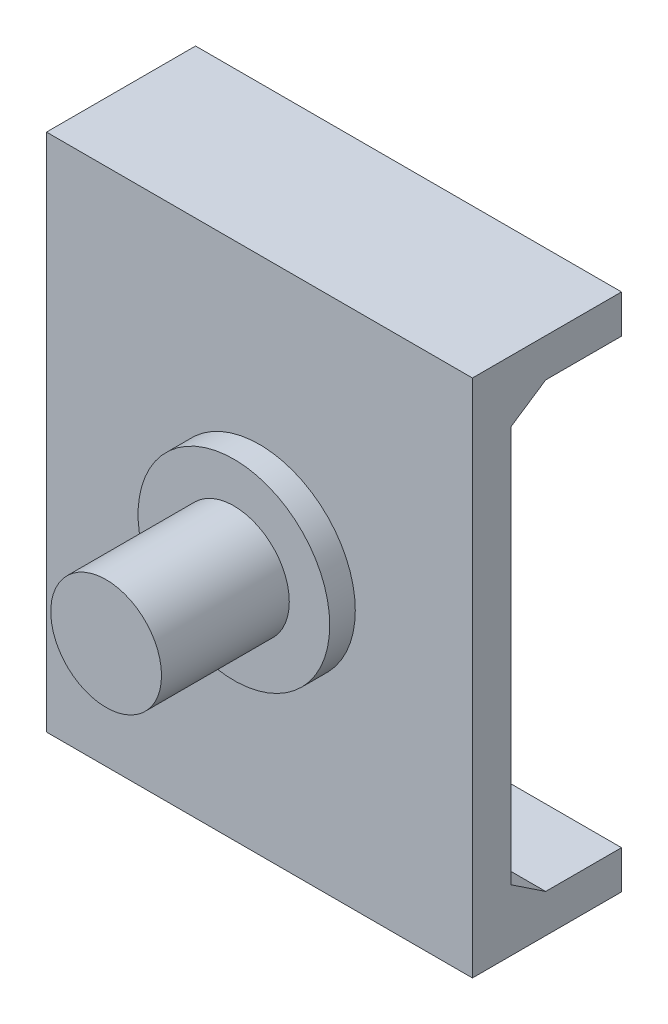
ISO-10303-21;
HEADER;
FILE_DESCRIPTION(('STEP AP214'),'2;1');
FILE_NAME('part.step','',(''),(''),'','','');
FILE_SCHEMA(('AUTOMOTIVE_DESIGN { 1 0 10303 214 1 1 1 1 }'));
ENDSEC;
DATA;
#1=APPLICATION_CONTEXT('core data for automotive mechanical design processes');
#2=APPLICATION_PROTOCOL_DEFINITION('international standard','automotive_design',2000,#1);
#3=PRODUCT_CONTEXT('',#1,'mechanical');
#4=PRODUCT('Part','Part','',(#3));
#5=PRODUCT_RELATED_PRODUCT_CATEGORY('part','',(#4));
#6=PRODUCT_DEFINITION_FORMATION('','',#4);
#7=PRODUCT_DEFINITION_CONTEXT('part definition',#1,'design');
#8=PRODUCT_DEFINITION('design','',#6,#7);
#9=PRODUCT_DEFINITION_SHAPE('','',#8);
#10=(LENGTH_UNIT() NAMED_UNIT(*) SI_UNIT(.MILLI.,.METRE.));
#11=(NAMED_UNIT(*) PLANE_ANGLE_UNIT() SI_UNIT($,.RADIAN.));
#12=(NAMED_UNIT(*) SI_UNIT($,.STERADIAN.) SOLID_ANGLE_UNIT());
#13=UNCERTAINTY_MEASURE_WITH_UNIT(LENGTH_MEASURE(1.E-05),#10,'distance_accuracy_value','');
#14=(GEOMETRIC_REPRESENTATION_CONTEXT(3) GLOBAL_UNCERTAINTY_ASSIGNED_CONTEXT((#13)) GLOBAL_UNIT_ASSIGNED_CONTEXT((#10,
#11,#12)) REPRESENTATION_CONTEXT('',''));
#15=CARTESIAN_POINT('',(0.,0.,0.));
#16=DIRECTION('',(0.,0.,1.));
#17=DIRECTION('',(1.,0.,0.));
#18=AXIS2_PLACEMENT_3D('',#15,#16,#17);
#19=CARTESIAN_POINT('',(0.,0.,-5.));
#20=DIRECTION('',(0.,0.,-1.));
#21=DIRECTION('',(-1.,0.,0.));
#22=AXIS2_PLACEMENT_3D('',#19,#20,#21);
#23=PLANE('',#22);
#24=DIRECTION('',(-1.,0.,0.));
#25=VECTOR('',#24,1.);
#26=CARTESIAN_POINT('',(0.,-10.4,-5.));
#27=LINE('',#26,#25);
#28=CARTESIAN_POINT('',(10.,-10.4,-5.));
#29=VERTEX_POINT('',#28);
#30=CARTESIAN_POINT('',(-10.,-10.4,-5.));
#31=VERTEX_POINT('',#30);
#32=EDGE_CURVE('E40',#29,#31,#27,.T.);
#33=ORIENTED_EDGE('',*,*,#32,.F.);
#34=DIRECTION('',(0.,1.,0.));
#35=VECTOR('',#34,1.);
#36=CARTESIAN_POINT('',(10.,-12.2,-5.));
#37=LINE('',#36,#35);
#38=CARTESIAN_POINT('',(10.,-12.2,-5.));
#39=VERTEX_POINT('',#38);
#40=EDGE_CURVE('E165',#39,#29,#37,.T.);
#41=ORIENTED_EDGE('',*,*,#40,.F.);
#42=DIRECTION('',(1.,0.,0.));
#43=VECTOR('',#42,1.);
#44=CARTESIAN_POINT('',(-10.,-12.2,-5.));
#45=LINE('',#44,#43);
#46=CARTESIAN_POINT('',(-10.,-12.2,-5.));
#47=VERTEX_POINT('',#46);
#48=EDGE_CURVE('E173',#47,#39,#45,.T.);
#49=ORIENTED_EDGE('',*,*,#48,.F.);
#50=DIRECTION('',(0.,-1.,0.));
#51=VECTOR('',#50,1.);
#52=CARTESIAN_POINT('',(-10.,-12.2,-5.));
#53=LINE('',#52,#51);
#54=EDGE_CURVE('E171',#31,#47,#53,.T.);
#55=ORIENTED_EDGE('',*,*,#54,.F.);
#56=EDGE_LOOP('',(#33,#41,#49,#55));
#57=FACE_BOUND('',#56,.T.);
#58=ADVANCED_FACE('F36',(#57),#23,.T.);
#59=CARTESIAN_POINT('',(10.,-12.2,2.));
#60=DIRECTION('',(-1.,0.,0.));
#61=DIRECTION('',(0.,0.,1.));
#62=AXIS2_PLACEMENT_3D('',#59,#60,#61);
#63=PLANE('',#62);
#64=ORIENTED_EDGE('',*,*,#40,.T.);
#65=DIRECTION('',(0.,0.,-1.));
#66=VECTOR('',#65,1.);
#67=CARTESIAN_POINT('',(10.,-10.4,-8.2));
#68=LINE('',#67,#66);
#69=CARTESIAN_POINT('',(10.,-10.4,-1.4394448724536));
#70=VERTEX_POINT('',#69);
#71=EDGE_CURVE('E138',#70,#29,#68,.T.);
#72=ORIENTED_EDGE('',*,*,#71,.F.);
#73=DIRECTION('',(0.,-0.554700196225229,-0.832050294337844));
#74=VECTOR('',#73,1.);
#75=CARTESIAN_POINT('',(10.,-9.3070367516976,0.200000000000001));
#76=LINE('',#75,#74);
#77=CARTESIAN_POINT('',(10.,-9.3070367516976,0.200000000000001));
#78=VERTEX_POINT('',#77);
#79=EDGE_CURVE('E140',#78,#70,#76,.T.);
#80=ORIENTED_EDGE('',*,*,#79,.F.);
#81=DIRECTION('',(0.,-1.,0.));
#82=VECTOR('',#81,1.);
#83=CARTESIAN_POINT('',(10.,-7.95,0.200000000000001));
#84=LINE('',#83,#82);
#85=CARTESIAN_POINT('',(10.,9.3070367516976,0.2));
#86=VERTEX_POINT('',#85);
#87=EDGE_CURVE('E154',#86,#78,#84,.T.);
#88=ORIENTED_EDGE('',*,*,#87,.F.);
#89=DIRECTION('',(0.,-0.554700196225229,0.832050294337844));
#90=VECTOR('',#89,1.);
#91=CARTESIAN_POINT('',(10.,10.4,-1.4394448724536));
#92=LINE('',#91,#90);
#93=CARTESIAN_POINT('',(10.,10.4,-1.4394448724536));
#94=VERTEX_POINT('',#93);
#95=EDGE_CURVE('E151',#94,#86,#92,.T.);
#96=ORIENTED_EDGE('',*,*,#95,.F.);
#97=DIRECTION('',(0.,0.,1.));
#98=VECTOR('',#97,1.);
#99=CARTESIAN_POINT('',(10.,10.4,-1.4394448724536));
#100=LINE('',#99,#98);
#101=CARTESIAN_POINT('',(10.,10.4,-5.));
#102=VERTEX_POINT('',#101);
#103=EDGE_CURVE('E118',#102,#94,#100,.T.);
#104=ORIENTED_EDGE('',*,*,#103,.F.);
#105=CARTESIAN_POINT('',(10.,12.2,-5.));
#106=VERTEX_POINT('',#105);
#107=EDGE_CURVE('E161',#102,#106,#37,.T.);
#108=ORIENTED_EDGE('',*,*,#107,.T.);
#109=DIRECTION('',(0.,0.,-1.));
#110=VECTOR('',#109,1.);
#111=CARTESIAN_POINT('',(10.,12.2,2.));
#112=LINE('',#111,#110);
#113=CARTESIAN_POINT('',(10.,12.2,2.));
#114=VERTEX_POINT('',#113);
#115=EDGE_CURVE('E190',#114,#106,#112,.T.);
#116=ORIENTED_EDGE('',*,*,#115,.F.);
#117=DIRECTION('',(0.,1.,0.));
#118=VECTOR('',#117,1.);
#119=CARTESIAN_POINT('',(10.,-12.2,2.));
#120=LINE('',#119,#118);
#121=CARTESIAN_POINT('',(10.,-12.2,2.));
#122=VERTEX_POINT('',#121);
#123=EDGE_CURVE('E176',#122,#114,#120,.T.);
#124=ORIENTED_EDGE('',*,*,#123,.F.);
#125=DIRECTION('',(0.,0.,-1.));
#126=VECTOR('',#125,1.);
#127=CARTESIAN_POINT('',(10.,-12.2,2.));
#128=LINE('',#127,#126);
#129=EDGE_CURVE('E183',#122,#39,#128,.T.);
#130=ORIENTED_EDGE('',*,*,#129,.T.);
#131=EDGE_LOOP('',(#64,#72,#80,#88,#96,#104,#108,#116,#124,#130));
#132=FACE_BOUND('',#131,.T.);
#133=ADVANCED_FACE('F38',(#132),#63,.F.);
#134=CARTESIAN_POINT('',(-10.,12.2,2.));
#135=DIRECTION('',(0.,-1.,0.));
#136=DIRECTION('',(0.,0.,-1.));
#137=AXIS2_PLACEMENT_3D('',#134,#135,#136);
#138=PLANE('',#137);
#139=ORIENTED_EDGE('',*,*,#115,.T.);
#140=DIRECTION('',(-1.,0.,0.));
#141=VECTOR('',#140,1.);
#142=CARTESIAN_POINT('',(-10.,12.2,-5.));
#143=LINE('',#142,#141);
#144=CARTESIAN_POINT('',(-10.,12.2,-5.));
#145=VERTEX_POINT('',#144);
#146=EDGE_CURVE('E168',#106,#145,#143,.T.);
#147=ORIENTED_EDGE('',*,*,#146,.T.);
#148=DIRECTION('',(0.,0.,-1.));
#149=VECTOR('',#148,1.);
#150=CARTESIAN_POINT('',(-10.,12.2,2.));
#151=LINE('',#150,#149);
#152=CARTESIAN_POINT('',(-10.,12.2,2.));
#153=VERTEX_POINT('',#152);
#154=EDGE_CURVE('E188',#153,#145,#151,.T.);
#155=ORIENTED_EDGE('',*,*,#154,.F.);
#156=DIRECTION('',(-1.,0.,0.));
#157=VECTOR('',#156,1.);
#158=CARTESIAN_POINT('',(-10.,12.2,2.));
#159=LINE('',#158,#157);
#160=EDGE_CURVE('E178',#114,#153,#159,.T.);
#161=ORIENTED_EDGE('',*,*,#160,.F.);
#162=EDGE_LOOP('',(#139,#147,#155,#161));
#163=FACE_BOUND('',#162,.T.);
#164=ADVANCED_FACE('F213',(#163),#138,.F.);
#165=CARTESIAN_POINT('',(-10.,-12.2,2.));
#166=DIRECTION('',(1.,0.,0.));
#167=DIRECTION('',(0.,0.,-1.));
#168=AXIS2_PLACEMENT_3D('',#165,#166,#167);
#169=PLANE('',#168);
#170=DIRECTION('',(0.,-0.554700196225229,-0.832050294337844));
#171=VECTOR('',#170,1.);
#172=CARTESIAN_POINT('',(-10.,-9.3070367516976,0.200000000000001));
#173=LINE('',#172,#171);
#174=CARTESIAN_POINT('',(-10.,-9.3070367516976,0.200000000000001));
#175=VERTEX_POINT('',#174);
#176=CARTESIAN_POINT('',(-10.,-10.4,-1.4394448724536));
#177=VERTEX_POINT('',#176);
#178=EDGE_CURVE('E146',#175,#177,#173,.T.);
#179=ORIENTED_EDGE('',*,*,#178,.T.);
#180=DIRECTION('',(0.,0.,-1.));
#181=VECTOR('',#180,1.);
#182=CARTESIAN_POINT('',(-10.,-10.4,-8.2));
#183=LINE('',#182,#181);
#184=EDGE_CURVE('E123',#177,#31,#183,.T.);
#185=ORIENTED_EDGE('',*,*,#184,.T.);
#186=ORIENTED_EDGE('',*,*,#54,.T.);
#187=DIRECTION('',(0.,0.,-1.));
#188=VECTOR('',#187,1.);
#189=CARTESIAN_POINT('',(-10.,-12.2,2.));
#190=LINE('',#189,#188);
#191=CARTESIAN_POINT('',(-10.,-12.2,2.));
#192=VERTEX_POINT('',#191);
#193=EDGE_CURVE('E185',#192,#47,#190,.T.);
#194=ORIENTED_EDGE('',*,*,#193,.F.);
#195=DIRECTION('',(0.,-1.,0.));
#196=VECTOR('',#195,1.);
#197=CARTESIAN_POINT('',(-10.,-12.2,2.));
#198=LINE('',#197,#196);
#199=EDGE_CURVE('E180',#153,#192,#198,.T.);
#200=ORIENTED_EDGE('',*,*,#199,.F.);
#201=ORIENTED_EDGE('',*,*,#154,.T.);
#202=CARTESIAN_POINT('',(-10.,10.4,-5.));
#203=VERTEX_POINT('',#202);
#204=EDGE_CURVE('E137',#145,#203,#53,.T.);
#205=ORIENTED_EDGE('',*,*,#204,.T.);
#206=DIRECTION('',(0.,0.,1.));
#207=VECTOR('',#206,1.);
#208=CARTESIAN_POINT('',(-10.,10.4,-1.4394448724536));
#209=LINE('',#208,#207);
#210=CARTESIAN_POINT('',(-10.,10.4,-1.4394448724536));
#211=VERTEX_POINT('',#210);
#212=EDGE_CURVE('E53',#203,#211,#209,.T.);
#213=ORIENTED_EDGE('',*,*,#212,.T.);
#214=DIRECTION('',(0.,-0.554700196225229,0.832050294337844));
#215=VECTOR('',#214,1.);
#216=CARTESIAN_POINT('',(-10.,10.4,-1.4394448724536));
#217=LINE('',#216,#215);
#218=CARTESIAN_POINT('',(-10.,9.3070367516976,0.2));
#219=VERTEX_POINT('',#218);
#220=EDGE_CURVE('E126',#211,#219,#217,.T.);
#221=ORIENTED_EDGE('',*,*,#220,.T.);
#222=DIRECTION('',(0.,-1.,0.));
#223=VECTOR('',#222,1.);
#224=CARTESIAN_POINT('',(-10.,7.95,0.200000000000001));
#225=LINE('',#224,#223);
#226=EDGE_CURVE('E131',#219,#175,#225,.T.);
#227=ORIENTED_EDGE('',*,*,#226,.T.);
#228=EDGE_LOOP('',(#179,#185,#186,#194,#200,#201,#205,#213,#221,#227));
#229=FACE_BOUND('',#228,.T.);
#230=ADVANCED_FACE('F135',(#229),#169,.F.);
#231=CARTESIAN_POINT('',(-10.,-12.2,2.));
#232=DIRECTION('',(0.,1.,0.));
#233=DIRECTION('',(0.,0.,1.));
#234=AXIS2_PLACEMENT_3D('',#231,#232,#233);
#235=PLANE('',#234);
#236=ORIENTED_EDGE('',*,*,#193,.T.);
#237=ORIENTED_EDGE('',*,*,#48,.T.);
#238=ORIENTED_EDGE('',*,*,#129,.F.);
#239=DIRECTION('',(1.,0.,0.));
#240=VECTOR('',#239,1.);
#241=CARTESIAN_POINT('',(-10.,-12.2,2.));
#242=LINE('',#241,#240);
#243=EDGE_CURVE('E61',#192,#122,#242,.T.);
#244=ORIENTED_EDGE('',*,*,#243,.F.);
#245=EDGE_LOOP('',(#236,#237,#238,#244));
#246=FACE_BOUND('',#245,.T.);
#247=ADVANCED_FACE('F204',(#246),#235,.F.);
#248=CARTESIAN_POINT('',(0.,0.,2.));
#249=DIRECTION('',(0.,0.,-1.));
#250=DIRECTION('',(-1.,0.,0.));
#251=AXIS2_PLACEMENT_3D('',#248,#249,#250);
#252=PLANE('',#251);
#253=CARTESIAN_POINT('',(0.,0.,2.));
#254=DIRECTION('',(0.,0.,1.));
#255=DIRECTION('',(1.,0.,0.));
#256=AXIS2_PLACEMENT_3D('',#253,#254,#255);
#257=CIRCLE('',#256,4.5);
#258=CARTESIAN_POINT('',(4.5,0.,2.));
#259=VERTEX_POINT('',#258);
#260=EDGE_CURVE('E45',#259,#259,#257,.T.);
#261=ORIENTED_EDGE('',*,*,#260,.F.);
#262=EDGE_LOOP('',(#261));
#263=FACE_BOUND('',#262,.T.);
#264=ORIENTED_EDGE('',*,*,#123,.T.);
#265=ORIENTED_EDGE('',*,*,#160,.T.);
#266=ORIENTED_EDGE('',*,*,#199,.T.);
#267=ORIENTED_EDGE('',*,*,#243,.T.);
#268=EDGE_LOOP('',(#264,#265,#266,#267));
#269=FACE_BOUND('',#268,.T.);
#270=ADVANCED_FACE('F201',(#263,#269),#252,.F.);
#271=DIRECTION('',(1.,0.,0.));
#272=VECTOR('',#271,1.);
#273=CARTESIAN_POINT('',(0.,10.4,-5.));
#274=LINE('',#273,#272);
#275=EDGE_CURVE('E192',#203,#102,#274,.T.);
#276=ORIENTED_EDGE('',*,*,#275,.F.);
#277=ORIENTED_EDGE('',*,*,#204,.F.);
#278=ORIENTED_EDGE('',*,*,#146,.F.);
#279=ORIENTED_EDGE('',*,*,#107,.F.);
#280=EDGE_LOOP('',(#276,#277,#278,#279));
#281=FACE_BOUND('',#280,.T.);
#282=ADVANCED_FACE('F203',(#281),#23,.T.);
#283=CARTESIAN_POINT('',(-10.,-10.4,-8.2));
#284=DIRECTION('',(0.,-1.,0.));
#285=DIRECTION('',(0.,0.,-1.));
#286=AXIS2_PLACEMENT_3D('',#283,#284,#285);
#287=PLANE('',#286);
#288=ORIENTED_EDGE('',*,*,#32,.T.);
#289=ORIENTED_EDGE('',*,*,#184,.F.);
#290=DIRECTION('',(1.,0.,0.));
#291=VECTOR('',#290,1.);
#292=CARTESIAN_POINT('',(-10.,-10.4,-1.4394448724536));
#293=LINE('',#292,#291);
#294=EDGE_CURVE('E159',#177,#70,#293,.T.);
#295=ORIENTED_EDGE('',*,*,#294,.T.);
#296=ORIENTED_EDGE('',*,*,#71,.T.);
#297=EDGE_LOOP('',(#288,#289,#295,#296));
#298=FACE_BOUND('',#297,.T.);
#299=ADVANCED_FACE('F216',(#298),#287,.F.);
#300=CARTESIAN_POINT('',(-10.,-9.3070367516976,0.200000000000001));
#301=DIRECTION('',(0.,-0.832050294337844,0.554700196225229));
#302=DIRECTION('',(0.,-0.554700196225229,-0.832050294337844));
#303=AXIS2_PLACEMENT_3D('',#300,#301,#302);
#304=PLANE('',#303);
#305=ORIENTED_EDGE('',*,*,#79,.T.);
#306=ORIENTED_EDGE('',*,*,#294,.F.);
#307=ORIENTED_EDGE('',*,*,#178,.F.);
#308=DIRECTION('',(1.,0.,0.));
#309=VECTOR('',#308,1.);
#310=CARTESIAN_POINT('',(-10.,-9.3070367516976,0.200000000000001));
#311=LINE('',#310,#309);
#312=EDGE_CURVE('E162',#175,#78,#311,.T.);
#313=ORIENTED_EDGE('',*,*,#312,.T.);
#314=EDGE_LOOP('',(#305,#306,#307,#313));
#315=FACE_BOUND('',#314,.T.);
#316=ADVANCED_FACE('F221',(#315),#304,.F.);
#317=CARTESIAN_POINT('',(-10.,-7.95,0.200000000000001));
#318=DIRECTION('',(0.,0.,1.));
#319=DIRECTION('',(1.,0.,0.));
#320=AXIS2_PLACEMENT_3D('',#317,#318,#319);
#321=PLANE('',#320);
#322=ORIENTED_EDGE('',*,*,#87,.T.);
#323=ORIENTED_EDGE('',*,*,#312,.F.);
#324=ORIENTED_EDGE('',*,*,#226,.F.);
#325=DIRECTION('',(1.,0.,0.));
#326=VECTOR('',#325,1.);
#327=CARTESIAN_POINT('',(-10.,9.3070367516976,0.2));
#328=LINE('',#327,#326);
#329=EDGE_CURVE('E122',#219,#86,#328,.T.);
#330=ORIENTED_EDGE('',*,*,#329,.T.);
#331=EDGE_LOOP('',(#322,#323,#324,#330));
#332=FACE_BOUND('',#331,.T.);
#333=ADVANCED_FACE('F241',(#332),#321,.F.);
#334=CARTESIAN_POINT('',(-10.,10.4,-1.4394448724536));
#335=DIRECTION('',(0.,0.832050294337844,0.554700196225229));
#336=DIRECTION('',(0.,-0.554700196225229,0.832050294337844));
#337=AXIS2_PLACEMENT_3D('',#334,#335,#336);
#338=PLANE('',#337);
#339=ORIENTED_EDGE('',*,*,#95,.T.);
#340=ORIENTED_EDGE('',*,*,#329,.F.);
#341=ORIENTED_EDGE('',*,*,#220,.F.);
#342=DIRECTION('',(1.,0.,0.));
#343=VECTOR('',#342,1.);
#344=CARTESIAN_POINT('',(-10.,10.4,-1.4394448724536));
#345=LINE('',#344,#343);
#346=EDGE_CURVE('E114',#211,#94,#345,.T.);
#347=ORIENTED_EDGE('',*,*,#346,.T.);
#348=EDGE_LOOP('',(#339,#340,#341,#347));
#349=FACE_BOUND('',#348,.T.);
#350=ADVANCED_FACE('F127',(#349),#338,.F.);
#351=CARTESIAN_POINT('',(-10.,10.4,-1.4394448724536));
#352=DIRECTION('',(0.,1.,0.));
#353=DIRECTION('',(0.,0.,1.));
#354=AXIS2_PLACEMENT_3D('',#351,#352,#353);
#355=PLANE('',#354);
#356=ORIENTED_EDGE('',*,*,#275,.T.);
#357=ORIENTED_EDGE('',*,*,#103,.T.);
#358=ORIENTED_EDGE('',*,*,#346,.F.);
#359=ORIENTED_EDGE('',*,*,#212,.F.);
#360=EDGE_LOOP('',(#356,#357,#358,#359));
#361=FACE_BOUND('',#360,.T.);
#362=ADVANCED_FACE('F116',(#361),#355,.F.);
#363=CARTESIAN_POINT('',(0.,0.,3.2));
#364=DIRECTION('',(0.,0.,-1.));
#365=DIRECTION('',(-1.,0.,0.));
#366=AXIS2_PLACEMENT_3D('',#363,#364,#365);
#367=CYLINDRICAL_SURFACE('',#366,4.5);
#368=CARTESIAN_POINT('',(0.,0.,3.2));
#369=DIRECTION('',(0.,0.,1.));
#370=DIRECTION('',(1.,0.,0.));
#371=AXIS2_PLACEMENT_3D('',#368,#369,#370);
#372=CIRCLE('',#371,4.5);
#373=CARTESIAN_POINT('',(4.5,0.,3.2));
#374=VERTEX_POINT('',#373);
#375=EDGE_CURVE('E152',#374,#374,#372,.T.);
#376=ORIENTED_EDGE('',*,*,#375,.F.);
#377=EDGE_LOOP('',(#376));
#378=FACE_BOUND('',#377,.T.);
#379=ORIENTED_EDGE('',*,*,#260,.T.);
#380=EDGE_LOOP('',(#379));
#381=FACE_BOUND('',#380,.T.);
#382=ADVANCED_FACE('F199',(#378,#381),#367,.T.);
#383=CARTESIAN_POINT('',(0.,0.,3.2));
#384=DIRECTION('',(0.,0.,1.));
#385=DIRECTION('',(1.,0.,0.));
#386=AXIS2_PLACEMENT_3D('',#383,#384,#385);
#387=PLANE('',#386);
#388=CARTESIAN_POINT('',(0.,0.,3.2));
#389=DIRECTION('',(0.,0.,1.));
#390=DIRECTION('',(1.,0.,0.));
#391=AXIS2_PLACEMENT_3D('',#388,#389,#390);
#392=CIRCLE('',#391,2.6);
#393=CARTESIAN_POINT('',(2.6,0.,3.2));
#394=VERTEX_POINT('',#393);
#395=EDGE_CURVE('E11',#394,#394,#392,.T.);
#396=ORIENTED_EDGE('',*,*,#395,.F.);
#397=EDGE_LOOP('',(#396));
#398=FACE_BOUND('',#397,.T.);
#399=ORIENTED_EDGE('',*,*,#375,.T.);
#400=EDGE_LOOP('',(#399));
#401=FACE_BOUND('',#400,.T.);
#402=ADVANCED_FACE('F254',(#398,#401),#387,.T.);
#403=CARTESIAN_POINT('',(0.,0.,9.2));
#404=DIRECTION('',(0.,0.,-1.));
#405=DIRECTION('',(-1.,0.,0.));
#406=AXIS2_PLACEMENT_3D('',#403,#404,#405);
#407=CYLINDRICAL_SURFACE('',#406,2.6);
#408=CARTESIAN_POINT('',(0.,0.,9.2));
#409=DIRECTION('',(0.,0.,1.));
#410=DIRECTION('',(1.,0.,0.));
#411=AXIS2_PLACEMENT_3D('',#408,#409,#410);
#412=CIRCLE('',#411,2.6);
#413=CARTESIAN_POINT('',(2.6,0.,9.2));
#414=VERTEX_POINT('',#413);
#415=EDGE_CURVE('E275',#414,#414,#412,.T.);
#416=ORIENTED_EDGE('',*,*,#415,.F.);
#417=EDGE_LOOP('',(#416));
#418=FACE_BOUND('',#417,.T.);
#419=ORIENTED_EDGE('',*,*,#395,.T.);
#420=EDGE_LOOP('',(#419));
#421=FACE_BOUND('',#420,.T.);
#422=ADVANCED_FACE('F260',(#418,#421),#407,.T.);
#423=CARTESIAN_POINT('',(0.,0.,9.2));
#424=DIRECTION('',(0.,0.,1.));
#425=DIRECTION('',(1.,0.,0.));
#426=AXIS2_PLACEMENT_3D('',#423,#424,#425);
#427=PLANE('',#426);
#428=ORIENTED_EDGE('',*,*,#415,.T.);
#429=EDGE_LOOP('',(#428));
#430=FACE_BOUND('',#429,.T.);
#431=ADVANCED_FACE('F267',(#430),#427,.T.);
#432=CLOSED_SHELL('',(#58,#133,#164,#230,#247,#270,#282,#299,#316,#333,#350,#362,#382,#402,#422,#431));
#433=MANIFOLD_SOLID_BREP('B2',#432);
#434=ADVANCED_BREP_SHAPE_REPRESENTATION('',(#18,#433),#14);
#435=SHAPE_DEFINITION_REPRESENTATION(#9,#434);
ENDSEC;
END-ISO-10303-21;
